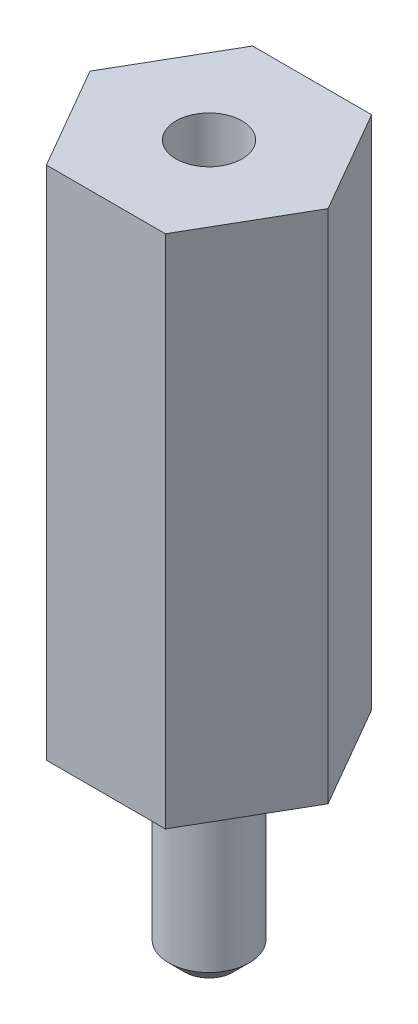
ISO-10303-21;
HEADER;
FILE_DESCRIPTION(('STEP AP214'),'2;1');
FILE_NAME('part.step','',(''),(''),'','','');
FILE_SCHEMA(('AUTOMOTIVE_DESIGN { 1 0 10303 214 1 1 1 1 }'));
ENDSEC;
DATA;
#1=APPLICATION_CONTEXT('core data for automotive mechanical design processes');
#2=APPLICATION_PROTOCOL_DEFINITION('international standard','automotive_design',2000,#1);
#3=PRODUCT_CONTEXT('',#1,'mechanical');
#4=PRODUCT('Part','Part','',(#3));
#5=PRODUCT_RELATED_PRODUCT_CATEGORY('part','',(#4));
#6=PRODUCT_DEFINITION_FORMATION('','',#4);
#7=PRODUCT_DEFINITION_CONTEXT('part definition',#1,'design');
#8=PRODUCT_DEFINITION('design','',#6,#7);
#9=PRODUCT_DEFINITION_SHAPE('','',#8);
#10=(LENGTH_UNIT() NAMED_UNIT(*) SI_UNIT(.MILLI.,.METRE.));
#11=(NAMED_UNIT(*) PLANE_ANGLE_UNIT() SI_UNIT($,.RADIAN.));
#12=(NAMED_UNIT(*) SI_UNIT($,.STERADIAN.) SOLID_ANGLE_UNIT());
#13=UNCERTAINTY_MEASURE_WITH_UNIT(LENGTH_MEASURE(1.E-05),#10,'distance_accuracy_value','');
#14=(GEOMETRIC_REPRESENTATION_CONTEXT(3) GLOBAL_UNCERTAINTY_ASSIGNED_CONTEXT((#13)) GLOBAL_UNIT_ASSIGNED_CONTEXT((#10,
#11,#12)) REPRESENTATION_CONTEXT('',''));
#15=CARTESIAN_POINT('',(0.,0.,0.));
#16=DIRECTION('',(0.,0.,1.));
#17=DIRECTION('',(1.,0.,0.));
#18=AXIS2_PLACEMENT_3D('',#15,#16,#17);
#19=CARTESIAN_POINT('',(1.84752086140684,16.,3.19999999999998));
#20=DIRECTION('',(-0.866025403784441,0.,-0.499999999999995));
#21=DIRECTION('',(-0.499999999999995,0.,0.866025403784442));
#22=AXIS2_PLACEMENT_3D('',#19,#20,#21);
#23=PLANE('',#22);
#24=DIRECTION('',(0.499999999999995,0.,-0.866025403784441));
#25=VECTOR('',#24,1.);
#26=CARTESIAN_POINT('',(1.84752086140684,0.,3.19999999999998));
#27=LINE('',#26,#25);
#28=CARTESIAN_POINT('',(1.84752086140684,0.,3.19999999999998));
#29=VERTEX_POINT('',#28);
#30=CARTESIAN_POINT('',(3.69504172281361,0.,0.));
#31=VERTEX_POINT('',#30);
#32=EDGE_CURVE('E126',#29,#31,#27,.T.);
#33=ORIENTED_EDGE('',*,*,#32,.T.);
#34=DIRECTION('',(0.,-1.,0.));
#35=VECTOR('',#34,1.);
#36=CARTESIAN_POINT('',(3.69504172281361,16.,0.));
#37=LINE('',#36,#35);
#38=CARTESIAN_POINT('',(3.69504172281361,16.,0.));
#39=VERTEX_POINT('',#38);
#40=EDGE_CURVE('E144',#39,#31,#37,.T.);
#41=ORIENTED_EDGE('',*,*,#40,.F.);
#42=DIRECTION('',(0.499999999999995,0.,-0.866025403784441));
#43=VECTOR('',#42,1.);
#44=CARTESIAN_POINT('',(1.84752086140684,16.,3.19999999999998));
#45=LINE('',#44,#43);
#46=CARTESIAN_POINT('',(1.84752086140684,16.,3.19999999999998));
#47=VERTEX_POINT('',#46);
#48=EDGE_CURVE('E137',#47,#39,#45,.T.);
#49=ORIENTED_EDGE('',*,*,#48,.F.);
#50=DIRECTION('',(0.,-1.,0.));
#51=VECTOR('',#50,1.);
#52=CARTESIAN_POINT('',(1.84752086140684,16.,3.19999999999998));
#53=LINE('',#52,#51);
#54=EDGE_CURVE('E122',#47,#29,#53,.T.);
#55=ORIENTED_EDGE('',*,*,#54,.T.);
#56=EDGE_LOOP('',(#33,#41,#49,#55));
#57=FACE_BOUND('',#56,.T.);
#58=ADVANCED_FACE('F38',(#57),#23,.F.);
#59=CARTESIAN_POINT('',(3.69504172281361,16.,0.));
#60=DIRECTION('',(-0.866025403784438,0.,0.500000000000001));
#61=DIRECTION('',(0.500000000000001,0.,0.866025403784438));
#62=AXIS2_PLACEMENT_3D('',#59,#60,#61);
#63=PLANE('',#62);
#64=DIRECTION('',(-0.500000000000001,0.,-0.866025403784438));
#65=VECTOR('',#64,1.);
#66=CARTESIAN_POINT('',(3.69504172281361,0.,0.));
#67=LINE('',#66,#65);
#68=CARTESIAN_POINT('',(1.8475208614068,0.,-3.20000000000001));
#69=VERTEX_POINT('',#68);
#70=EDGE_CURVE('E129',#31,#69,#67,.T.);
#71=ORIENTED_EDGE('',*,*,#70,.T.);
#72=DIRECTION('',(0.,-1.,0.));
#73=VECTOR('',#72,1.);
#74=CARTESIAN_POINT('',(1.8475208614068,16.,-3.20000000000001));
#75=LINE('',#74,#73);
#76=CARTESIAN_POINT('',(1.8475208614068,16.,-3.20000000000001));
#77=VERTEX_POINT('',#76);
#78=EDGE_CURVE('E141',#77,#69,#75,.T.);
#79=ORIENTED_EDGE('',*,*,#78,.F.);
#80=DIRECTION('',(-0.500000000000001,0.,-0.866025403784438));
#81=VECTOR('',#80,1.);
#82=CARTESIAN_POINT('',(3.69504172281361,16.,0.));
#83=LINE('',#82,#81);
#84=EDGE_CURVE('E94',#39,#77,#83,.T.);
#85=ORIENTED_EDGE('',*,*,#84,.F.);
#86=ORIENTED_EDGE('',*,*,#40,.T.);
#87=EDGE_LOOP('',(#71,#79,#85,#86));
#88=FACE_BOUND('',#87,.T.);
#89=ADVANCED_FACE('F162',(#88),#63,.F.);
#90=CARTESIAN_POINT('',(1.8475208614068,16.,-3.20000000000001));
#91=DIRECTION('',(0.,0.,1.));
#92=DIRECTION('',(1.,0.,0.));
#93=AXIS2_PLACEMENT_3D('',#90,#91,#92);
#94=PLANE('',#93);
#95=DIRECTION('',(-1.,0.,0.));
#96=VECTOR('',#95,1.);
#97=CARTESIAN_POINT('',(1.8475208614068,0.,-3.20000000000001));
#98=LINE('',#97,#96);
#99=CARTESIAN_POINT('',(-1.84752086140682,0.,-3.19999999999999));
#100=VERTEX_POINT('',#99);
#101=EDGE_CURVE('E132',#69,#100,#98,.T.);
#102=ORIENTED_EDGE('',*,*,#101,.T.);
#103=DIRECTION('',(0.,-1.,0.));
#104=VECTOR('',#103,1.);
#105=CARTESIAN_POINT('',(-1.84752086140682,16.,-3.19999999999999));
#106=LINE('',#105,#104);
#107=CARTESIAN_POINT('',(-1.84752086140682,16.,-3.19999999999999));
#108=VERTEX_POINT('',#107);
#109=EDGE_CURVE('E117',#108,#100,#106,.T.);
#110=ORIENTED_EDGE('',*,*,#109,.F.);
#111=DIRECTION('',(-1.,0.,0.));
#112=VECTOR('',#111,1.);
#113=CARTESIAN_POINT('',(1.8475208614068,16.,-3.20000000000001));
#114=LINE('',#113,#112);
#115=EDGE_CURVE('E108',#77,#108,#114,.T.);
#116=ORIENTED_EDGE('',*,*,#115,.F.);
#117=ORIENTED_EDGE('',*,*,#78,.T.);
#118=EDGE_LOOP('',(#102,#110,#116,#117));
#119=FACE_BOUND('',#118,.T.);
#120=ADVANCED_FACE('F165',(#119),#94,.F.);
#121=CARTESIAN_POINT('',(-1.84752086140682,16.,-3.19999999999999));
#122=DIRECTION('',(0.866025403784441,0.,0.499999999999995));
#123=DIRECTION('',(0.499999999999995,0.,-0.866025403784442));
#124=AXIS2_PLACEMENT_3D('',#121,#122,#123);
#125=PLANE('',#124);
#126=DIRECTION('',(-0.499999999999995,0.,0.866025403784441));
#127=VECTOR('',#126,1.);
#128=CARTESIAN_POINT('',(-1.84752086140682,0.,-3.19999999999999));
#129=LINE('',#128,#127);
#130=CARTESIAN_POINT('',(-3.69504172281361,0.,0.));
#131=VERTEX_POINT('',#130);
#132=EDGE_CURVE('E116',#100,#131,#129,.T.);
#133=ORIENTED_EDGE('',*,*,#132,.T.);
#134=DIRECTION('',(0.,-1.,0.));
#135=VECTOR('',#134,1.);
#136=CARTESIAN_POINT('',(-3.69504172281361,16.,0.));
#137=LINE('',#136,#135);
#138=CARTESIAN_POINT('',(-3.69504172281361,16.,0.));
#139=VERTEX_POINT('',#138);
#140=EDGE_CURVE('E113',#139,#131,#137,.T.);
#141=ORIENTED_EDGE('',*,*,#140,.F.);
#142=DIRECTION('',(-0.499999999999995,0.,0.866025403784441));
#143=VECTOR('',#142,1.);
#144=CARTESIAN_POINT('',(-1.84752086140682,16.,-3.19999999999999));
#145=LINE('',#144,#143);
#146=EDGE_CURVE('E102',#108,#139,#145,.T.);
#147=ORIENTED_EDGE('',*,*,#146,.F.);
#148=ORIENTED_EDGE('',*,*,#109,.T.);
#149=EDGE_LOOP('',(#133,#141,#147,#148));
#150=FACE_BOUND('',#149,.T.);
#151=ADVANCED_FACE('F114',(#150),#125,.F.);
#152=CARTESIAN_POINT('',(-3.69504172281361,16.,0.));
#153=DIRECTION('',(0.866025403784435,0.,-0.500000000000007));
#154=DIRECTION('',(-0.500000000000007,0.,-0.866025403784434));
#155=AXIS2_PLACEMENT_3D('',#152,#153,#154);
#156=PLANE('',#155);
#157=DIRECTION('',(0.500000000000007,0.,0.866025403784434));
#158=VECTOR('',#157,1.);
#159=CARTESIAN_POINT('',(-3.69504172281361,0.,0.));
#160=LINE('',#159,#158);
#161=CARTESIAN_POINT('',(-1.84752086140677,0.,3.20000000000002));
#162=VERTEX_POINT('',#161);
#163=EDGE_CURVE('E79',#131,#162,#160,.T.);
#164=ORIENTED_EDGE('',*,*,#163,.T.);
#165=DIRECTION('',(0.,-1.,0.));
#166=VECTOR('',#165,1.);
#167=CARTESIAN_POINT('',(-1.84752086140677,16.,3.20000000000002));
#168=LINE('',#167,#166);
#169=CARTESIAN_POINT('',(-1.84752086140677,16.,3.20000000000002));
#170=VERTEX_POINT('',#169);
#171=EDGE_CURVE('E118',#170,#162,#168,.T.);
#172=ORIENTED_EDGE('',*,*,#171,.F.);
#173=DIRECTION('',(0.500000000000007,0.,0.866025403784434));
#174=VECTOR('',#173,1.);
#175=CARTESIAN_POINT('',(-3.69504172281361,16.,0.));
#176=LINE('',#175,#174);
#177=EDGE_CURVE('E106',#139,#170,#176,.T.);
#178=ORIENTED_EDGE('',*,*,#177,.F.);
#179=ORIENTED_EDGE('',*,*,#140,.T.);
#180=EDGE_LOOP('',(#164,#172,#178,#179));
#181=FACE_BOUND('',#180,.T.);
#182=ADVANCED_FACE('F120',(#181),#156,.F.);
#183=CARTESIAN_POINT('',(-1.84752086140677,16.,3.20000000000002));
#184=DIRECTION('',(0.,0.,-1.));
#185=DIRECTION('',(-1.,0.,0.));
#186=AXIS2_PLACEMENT_3D('',#183,#184,#185);
#187=PLANE('',#186);
#188=DIRECTION('',(1.,0.,0.));
#189=VECTOR('',#188,1.);
#190=CARTESIAN_POINT('',(-1.84752086140677,0.,3.20000000000002));
#191=LINE('',#190,#189);
#192=EDGE_CURVE('E85',#162,#29,#191,.T.);
#193=ORIENTED_EDGE('',*,*,#192,.T.);
#194=ORIENTED_EDGE('',*,*,#54,.F.);
#195=DIRECTION('',(1.,0.,0.));
#196=VECTOR('',#195,1.);
#197=CARTESIAN_POINT('',(-1.84752086140677,16.,3.20000000000002));
#198=LINE('',#197,#196);
#199=EDGE_CURVE('E55',#170,#47,#198,.T.);
#200=ORIENTED_EDGE('',*,*,#199,.F.);
#201=ORIENTED_EDGE('',*,*,#171,.T.);
#202=EDGE_LOOP('',(#193,#194,#200,#201));
#203=FACE_BOUND('',#202,.T.);
#204=ADVANCED_FACE('F170',(#203),#187,.F.);
#205=CARTESIAN_POINT('',(0.,16.,0.));
#206=DIRECTION('',(0.,1.,0.));
#207=DIRECTION('',(0.,0.,1.));
#208=AXIS2_PLACEMENT_3D('',#205,#206,#207);
#209=PLANE('',#208);
#210=CARTESIAN_POINT('',(0.,16.,0.));
#211=DIRECTION('',(0.,1.,0.));
#212=DIRECTION('',(0.,0.,1.));
#213=AXIS2_PLACEMENT_3D('',#210,#211,#212);
#214=CIRCLE('',#213,1.025);
#215=CARTESIAN_POINT('',(0.,16.,1.025));
#216=VERTEX_POINT('',#215);
#217=EDGE_CURVE('E154',#216,#216,#214,.T.);
#218=ORIENTED_EDGE('',*,*,#217,.F.);
#219=EDGE_LOOP('',(#218));
#220=FACE_BOUND('',#219,.T.);
#221=ORIENTED_EDGE('',*,*,#48,.T.);
#222=ORIENTED_EDGE('',*,*,#84,.T.);
#223=ORIENTED_EDGE('',*,*,#115,.T.);
#224=ORIENTED_EDGE('',*,*,#146,.T.);
#225=ORIENTED_EDGE('',*,*,#177,.T.);
#226=ORIENTED_EDGE('',*,*,#199,.T.);
#227=EDGE_LOOP('',(#221,#222,#223,#224,#225,#226));
#228=FACE_BOUND('',#227,.T.);
#229=ADVANCED_FACE('F104',(#220,#228),#209,.T.);
#230=CARTESIAN_POINT('',(0.,0.,0.));
#231=DIRECTION('',(0.,1.,0.));
#232=DIRECTION('',(0.,0.,1.));
#233=AXIS2_PLACEMENT_3D('',#230,#231,#232);
#234=PLANE('',#233);
#235=CARTESIAN_POINT('',(0.,0.,0.));
#236=DIRECTION('',(0.,-1.,0.));
#237=DIRECTION('',(0.,0.,-1.));
#238=AXIS2_PLACEMENT_3D('',#235,#236,#237);
#239=CIRCLE('',#238,1.25);
#240=CARTESIAN_POINT('',(0.,0.,-1.25));
#241=VERTEX_POINT('',#240);
#242=EDGE_CURVE('E145',#241,#241,#239,.T.);
#243=ORIENTED_EDGE('',*,*,#242,.F.);
#244=EDGE_LOOP('',(#243));
#245=FACE_BOUND('',#244,.T.);
#246=ORIENTED_EDGE('',*,*,#32,.F.);
#247=ORIENTED_EDGE('',*,*,#192,.F.);
#248=ORIENTED_EDGE('',*,*,#163,.F.);
#249=ORIENTED_EDGE('',*,*,#132,.F.);
#250=ORIENTED_EDGE('',*,*,#101,.F.);
#251=ORIENTED_EDGE('',*,*,#70,.F.);
#252=EDGE_LOOP('',(#246,#247,#248,#249,#250,#251));
#253=FACE_BOUND('',#252,.T.);
#254=ADVANCED_FACE('F168',(#245,#253),#234,.F.);
#255=CARTESIAN_POINT('',(0.,9.65,0.));
#256=DIRECTION('',(0.,1.,0.));
#257=DIRECTION('',(0.,0.,1.));
#258=AXIS2_PLACEMENT_3D('',#255,#256,#257);
#259=CONICAL_SURFACE('',#258,1.025,1.02974425867665);
#260=CARTESIAN_POINT('',(0.,9.03411786549675,0.));
#261=VERTEX_POINT('',#260);
#262=VERTEX_LOOP('',#261);
#263=FACE_BOUND('',#262,.T.);
#264=CARTESIAN_POINT('',(0.,9.65,0.));
#265=DIRECTION('',(0.,1.,0.));
#266=DIRECTION('',(0.,0.,1.));
#267=AXIS2_PLACEMENT_3D('',#264,#265,#266);
#268=CIRCLE('',#267,1.025);
#269=CARTESIAN_POINT('',(0.,9.65,1.025));
#270=VERTEX_POINT('',#269);
#271=EDGE_CURVE('E130',#270,#270,#268,.T.);
#272=ORIENTED_EDGE('',*,*,#271,.T.);
#273=EDGE_LOOP('',(#272));
#274=FACE_BOUND('',#273,.T.);
#275=ADVANCED_FACE('F215',(#263,#274),#259,.F.);
#276=CARTESIAN_POINT('',(0.,16.,0.));
#277=DIRECTION('',(0.,1.,0.));
#278=DIRECTION('',(0.,0.,1.));
#279=AXIS2_PLACEMENT_3D('',#276,#277,#278);
#280=CYLINDRICAL_SURFACE('',#279,1.025);
#281=ORIENTED_EDGE('',*,*,#271,.F.);
#282=EDGE_LOOP('',(#281));
#283=FACE_BOUND('',#282,.T.);
#284=ORIENTED_EDGE('',*,*,#217,.T.);
#285=EDGE_LOOP('',(#284));
#286=FACE_BOUND('',#285,.T.);
#287=ADVANCED_FACE('F220',(#283,#286),#280,.F.);
#288=CARTESIAN_POINT('',(0.,-6.,0.));
#289=DIRECTION('',(0.,1.,0.));
#290=DIRECTION('',(0.,0.,1.));
#291=AXIS2_PLACEMENT_3D('',#288,#289,#290);
#292=CYLINDRICAL_SURFACE('',#291,1.25);
#293=CARTESIAN_POINT('',(0.,-5.5,0.));
#294=DIRECTION('',(0.,-1.,0.));
#295=DIRECTION('',(0.,0.,-1.));
#296=AXIS2_PLACEMENT_3D('',#293,#294,#295);
#297=CIRCLE('',#296,1.25);
#298=CARTESIAN_POINT('',(0.,-5.5,-1.25));
#299=VERTEX_POINT('',#298);
#300=EDGE_CURVE('E11',#299,#299,#297,.F.);
#301=ORIENTED_EDGE('',*,*,#300,.T.);
#302=EDGE_LOOP('',(#301));
#303=FACE_BOUND('',#302,.T.);
#304=ORIENTED_EDGE('',*,*,#242,.T.);
#305=EDGE_LOOP('',(#304));
#306=FACE_BOUND('',#305,.T.);
#307=ADVANCED_FACE('F231',(#303,#306),#292,.T.);
#308=CARTESIAN_POINT('',(0.,-6.,0.));
#309=DIRECTION('',(0.,-1.,0.));
#310=DIRECTION('',(0.,0.,-1.));
#311=AXIS2_PLACEMENT_3D('',#308,#309,#310);
#312=PLANE('',#311);
#313=CARTESIAN_POINT('',(0.,-6.,0.));
#314=DIRECTION('',(0.,-1.,0.));
#315=DIRECTION('',(0.,0.,-1.));
#316=AXIS2_PLACEMENT_3D('',#313,#314,#315);
#317=CIRCLE('',#316,0.750000000000001);
#318=CARTESIAN_POINT('',(0.,-6.,-0.750000000000001));
#319=VERTEX_POINT('',#318);
#320=EDGE_CURVE('E47',#319,#319,#317,.T.);
#321=ORIENTED_EDGE('',*,*,#320,.T.);
#322=EDGE_LOOP('',(#321));
#323=FACE_BOUND('',#322,.T.);
#324=ADVANCED_FACE('F247',(#323),#312,.T.);
#325=CARTESIAN_POINT('',(0.,-6.,0.));
#326=DIRECTION('',(0.,1.,0.));
#327=DIRECTION('',(0.,0.,1.));
#328=AXIS2_PLACEMENT_3D('',#325,#326,#327);
#329=CONICAL_SURFACE('',#328,0.750000000000001,0.785398163397447);
#330=ORIENTED_EDGE('',*,*,#300,.F.);
#331=EDGE_LOOP('',(#330));
#332=FACE_BOUND('',#331,.T.);
#333=ORIENTED_EDGE('',*,*,#320,.F.);
#334=EDGE_LOOP('',(#333));
#335=FACE_BOUND('',#334,.T.);
#336=ADVANCED_FACE('F40',(#332,#335),#329,.T.);
#337=CLOSED_SHELL('',(#58,#89,#120,#151,#182,#204,#229,#254,#275,#287,#307,#324,#336));
#338=MANIFOLD_SOLID_BREP('B2',#337);
#339=ADVANCED_BREP_SHAPE_REPRESENTATION('',(#18,#338),#14);
#340=SHAPE_DEFINITION_REPRESENTATION(#9,#339);
ENDSEC;
END-ISO-10303-21;
